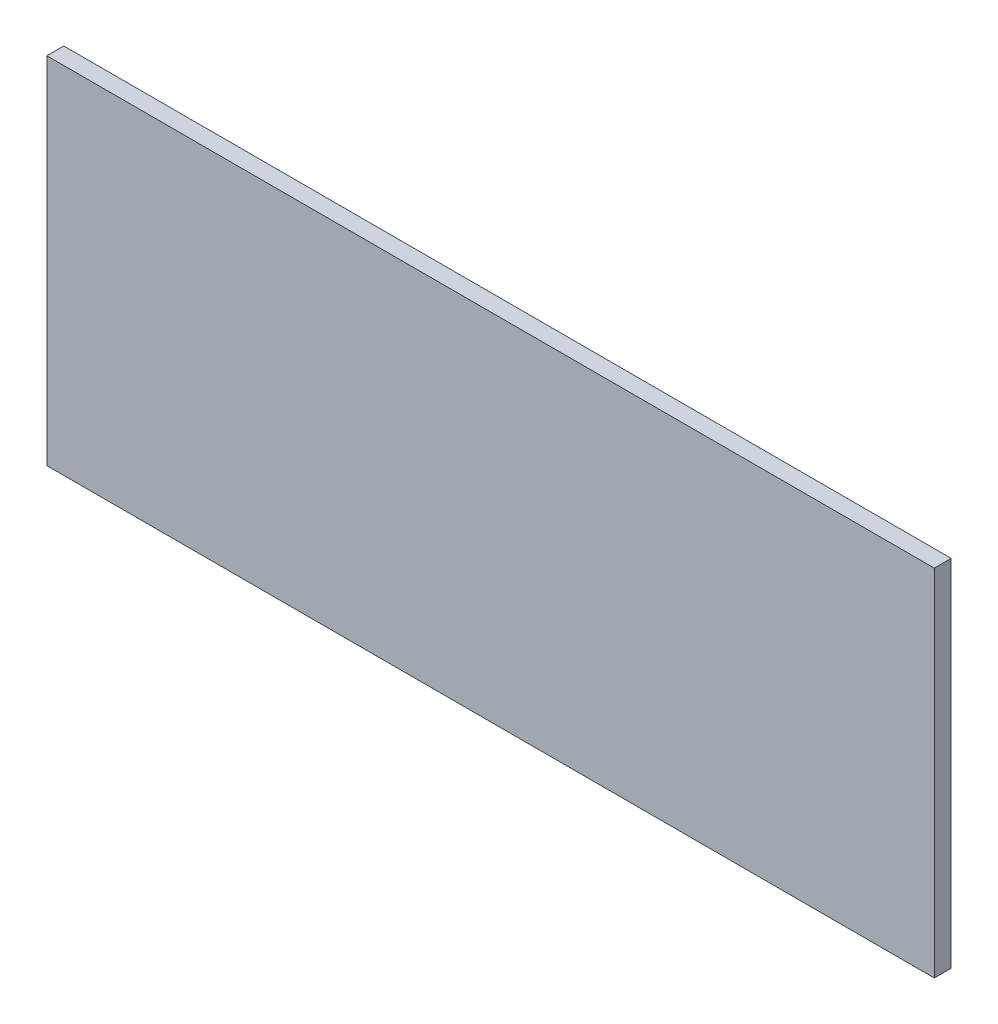
ISO-10303-21;
HEADER;
FILE_DESCRIPTION(('STEP AP214'),'2;1');
FILE_NAME('part.step','',(''),(''),'','','');
FILE_SCHEMA(('AUTOMOTIVE_DESIGN { 1 0 10303 214 1 1 1 1 }'));
ENDSEC;
DATA;
#1=APPLICATION_CONTEXT('core data for automotive mechanical design processes');
#2=APPLICATION_PROTOCOL_DEFINITION('international standard','automotive_design',2000,#1);
#3=PRODUCT_CONTEXT('',#1,'mechanical');
#4=PRODUCT('Part','Part','',(#3));
#5=PRODUCT_RELATED_PRODUCT_CATEGORY('part','',(#4));
#6=PRODUCT_DEFINITION_FORMATION('','',#4);
#7=PRODUCT_DEFINITION_CONTEXT('part definition',#1,'design');
#8=PRODUCT_DEFINITION('design','',#6,#7);
#9=PRODUCT_DEFINITION_SHAPE('','',#8);
#10=(LENGTH_UNIT() NAMED_UNIT(*) SI_UNIT(.MILLI.,.METRE.));
#11=(NAMED_UNIT(*) PLANE_ANGLE_UNIT() SI_UNIT($,.RADIAN.));
#12=(NAMED_UNIT(*) SI_UNIT($,.STERADIAN.) SOLID_ANGLE_UNIT());
#13=UNCERTAINTY_MEASURE_WITH_UNIT(LENGTH_MEASURE(1.E-05),#10,'distance_accuracy_value','');
#14=(GEOMETRIC_REPRESENTATION_CONTEXT(3) GLOBAL_UNCERTAINTY_ASSIGNED_CONTEXT((#13)) GLOBAL_UNIT_ASSIGNED_CONTEXT((#10,
#11,#12)) REPRESENTATION_CONTEXT('',''));
#15=CARTESIAN_POINT('',(0.,0.,0.));
#16=DIRECTION('',(0.,0.,1.));
#17=DIRECTION('',(1.,0.,0.));
#18=AXIS2_PLACEMENT_3D('',#15,#16,#17);
#19=CARTESIAN_POINT('',(-90.5016149039087,84.,-4.));
#20=DIRECTION('',(-1.,0.,0.));
#21=DIRECTION('',(0.,-1.,0.));
#22=AXIS2_PLACEMENT_3D('',#19,#20,#21);
#23=PLANE('',#22);
#24=DIRECTION('',(0.,-1.,0.));
#25=VECTOR('',#24,1.);
#26=CARTESIAN_POINT('',(-90.5016149039087,84.,0.));
#27=LINE('',#26,#25);
#28=CARTESIAN_POINT('',(-90.5016149039087,84.,0.));
#29=VERTEX_POINT('',#28);
#30=CARTESIAN_POINT('',(-90.5016149039087,0.,0.));
#31=VERTEX_POINT('',#30);
#32=EDGE_CURVE('E97',#29,#31,#27,.T.);
#33=ORIENTED_EDGE('',*,*,#32,.F.);
#34=DIRECTION('',(0.,0.,1.));
#35=VECTOR('',#34,1.);
#36=CARTESIAN_POINT('',(-90.5016149039087,84.,-4.));
#37=LINE('',#36,#35);
#38=CARTESIAN_POINT('',(-90.5016149039087,84.,-4.));
#39=VERTEX_POINT('',#38);
#40=EDGE_CURVE('E11',#39,#29,#37,.T.);
#41=ORIENTED_EDGE('',*,*,#40,.F.);
#42=DIRECTION('',(0.,-1.,0.));
#43=VECTOR('',#42,1.);
#44=CARTESIAN_POINT('',(-90.5016149039087,84.,-4.));
#45=LINE('',#44,#43);
#46=CARTESIAN_POINT('',(-90.5016149039087,0.,-4.));
#47=VERTEX_POINT('',#46);
#48=EDGE_CURVE('E91',#39,#47,#45,.T.);
#49=ORIENTED_EDGE('',*,*,#48,.T.);
#50=DIRECTION('',(0.,0.,1.));
#51=VECTOR('',#50,1.);
#52=CARTESIAN_POINT('',(-90.5016149039087,0.,-4.));
#53=LINE('',#52,#51);
#54=EDGE_CURVE('E36',#47,#31,#53,.T.);
#55=ORIENTED_EDGE('',*,*,#54,.T.);
#56=EDGE_LOOP('',(#33,#41,#49,#55));
#57=FACE_BOUND('',#56,.T.);
#58=ADVANCED_FACE('F33',(#57),#23,.T.);
#59=CARTESIAN_POINT('',(-90.5016149039087,84.,-4.));
#60=DIRECTION('',(0.,1.,0.));
#61=DIRECTION('',(0.,0.,1.));
#62=AXIS2_PLACEMENT_3D('',#59,#60,#61);
#63=PLANE('',#62);
#64=DIRECTION('',(-1.,0.,0.));
#65=VECTOR('',#64,1.);
#66=CARTESIAN_POINT('',(-90.5016149039087,84.,0.));
#67=LINE('',#66,#65);
#68=CARTESIAN_POINT('',(119.498385096091,84.,0.));
#69=VERTEX_POINT('',#68);
#70=EDGE_CURVE('E93',#69,#29,#67,.T.);
#71=ORIENTED_EDGE('',*,*,#70,.F.);
#72=DIRECTION('',(0.,0.,1.));
#73=VECTOR('',#72,1.);
#74=CARTESIAN_POINT('',(119.498385096091,84.,-4.));
#75=LINE('',#74,#73);
#76=CARTESIAN_POINT('',(119.498385096091,84.,-4.));
#77=VERTEX_POINT('',#76);
#78=EDGE_CURVE('E42',#77,#69,#75,.T.);
#79=ORIENTED_EDGE('',*,*,#78,.F.);
#80=DIRECTION('',(-1.,0.,0.));
#81=VECTOR('',#80,1.);
#82=CARTESIAN_POINT('',(-90.5016149039087,84.,-4.));
#83=LINE('',#82,#81);
#84=EDGE_CURVE('E88',#77,#39,#83,.T.);
#85=ORIENTED_EDGE('',*,*,#84,.T.);
#86=ORIENTED_EDGE('',*,*,#40,.T.);
#87=EDGE_LOOP('',(#71,#79,#85,#86));
#88=FACE_BOUND('',#87,.T.);
#89=ADVANCED_FACE('F107',(#88),#63,.T.);
#90=CARTESIAN_POINT('',(119.498385096091,84.,-4.));
#91=DIRECTION('',(1.,0.,0.));
#92=DIRECTION('',(0.,1.,0.));
#93=AXIS2_PLACEMENT_3D('',#90,#91,#92);
#94=PLANE('',#93);
#95=DIRECTION('',(0.,1.,0.));
#96=VECTOR('',#95,1.);
#97=CARTESIAN_POINT('',(119.498385096091,84.,0.));
#98=LINE('',#97,#96);
#99=CARTESIAN_POINT('',(119.498385096091,0.,0.));
#100=VERTEX_POINT('',#99);
#101=EDGE_CURVE('E83',#100,#69,#98,.T.);
#102=ORIENTED_EDGE('',*,*,#101,.F.);
#103=DIRECTION('',(0.,0.,1.));
#104=VECTOR('',#103,1.);
#105=CARTESIAN_POINT('',(119.498385096091,0.,-4.));
#106=LINE('',#105,#104);
#107=CARTESIAN_POINT('',(119.498385096091,0.,-4.));
#108=VERTEX_POINT('',#107);
#109=EDGE_CURVE('E78',#108,#100,#106,.T.);
#110=ORIENTED_EDGE('',*,*,#109,.F.);
#111=DIRECTION('',(0.,1.,0.));
#112=VECTOR('',#111,1.);
#113=CARTESIAN_POINT('',(119.498385096091,84.,-4.));
#114=LINE('',#113,#112);
#115=EDGE_CURVE('E81',#108,#77,#114,.T.);
#116=ORIENTED_EDGE('',*,*,#115,.T.);
#117=ORIENTED_EDGE('',*,*,#78,.T.);
#118=EDGE_LOOP('',(#102,#110,#116,#117));
#119=FACE_BOUND('',#118,.T.);
#120=ADVANCED_FACE('F80',(#119),#94,.T.);
#121=CARTESIAN_POINT('',(-90.5016149039087,0.,-4.));
#122=DIRECTION('',(0.,-1.,0.));
#123=DIRECTION('',(0.,0.,-1.));
#124=AXIS2_PLACEMENT_3D('',#121,#122,#123);
#125=PLANE('',#124);
#126=DIRECTION('',(1.,0.,0.));
#127=VECTOR('',#126,1.);
#128=CARTESIAN_POINT('',(-90.5016149039087,0.,0.));
#129=LINE('',#128,#127);
#130=EDGE_CURVE('E100',#31,#100,#129,.T.);
#131=ORIENTED_EDGE('',*,*,#130,.F.);
#132=ORIENTED_EDGE('',*,*,#54,.F.);
#133=DIRECTION('',(1.,0.,0.));
#134=VECTOR('',#133,1.);
#135=CARTESIAN_POINT('',(-90.5016149039087,0.,-4.));
#136=LINE('',#135,#134);
#137=EDGE_CURVE('E87',#47,#108,#136,.T.);
#138=ORIENTED_EDGE('',*,*,#137,.T.);
#139=ORIENTED_EDGE('',*,*,#109,.T.);
#140=EDGE_LOOP('',(#131,#132,#138,#139));
#141=FACE_BOUND('',#140,.T.);
#142=ADVANCED_FACE('F90',(#141),#125,.T.);
#143=CARTESIAN_POINT('',(0.,0.,-4.));
#144=DIRECTION('',(0.,0.,1.));
#145=DIRECTION('',(1.,0.,0.));
#146=AXIS2_PLACEMENT_3D('',#143,#144,#145);
#147=PLANE('',#146);
#148=ORIENTED_EDGE('',*,*,#48,.F.);
#149=ORIENTED_EDGE('',*,*,#84,.F.);
#150=ORIENTED_EDGE('',*,*,#115,.F.);
#151=ORIENTED_EDGE('',*,*,#137,.F.);
#152=EDGE_LOOP('',(#148,#149,#150,#151));
#153=FACE_BOUND('',#152,.T.);
#154=ADVANCED_FACE('F86',(#153),#147,.F.);
#155=CARTESIAN_POINT('',(0.,0.,0.));
#156=DIRECTION('',(0.,0.,1.));
#157=DIRECTION('',(1.,0.,0.));
#158=AXIS2_PLACEMENT_3D('',#155,#156,#157);
#159=PLANE('',#158);
#160=ORIENTED_EDGE('',*,*,#32,.T.);
#161=ORIENTED_EDGE('',*,*,#130,.T.);
#162=ORIENTED_EDGE('',*,*,#101,.T.);
#163=ORIENTED_EDGE('',*,*,#70,.T.);
#164=EDGE_LOOP('',(#160,#161,#162,#163));
#165=FACE_BOUND('',#164,.T.);
#166=ADVANCED_FACE('F106',(#165),#159,.T.);
#167=CLOSED_SHELL('',(#58,#89,#120,#142,#154,#166));
#168=MANIFOLD_SOLID_BREP('B2',#167);
#169=ADVANCED_BREP_SHAPE_REPRESENTATION('',(#18,#168),#14);
#170=SHAPE_DEFINITION_REPRESENTATION(#9,#169);
ENDSEC;
END-ISO-10303-21;
